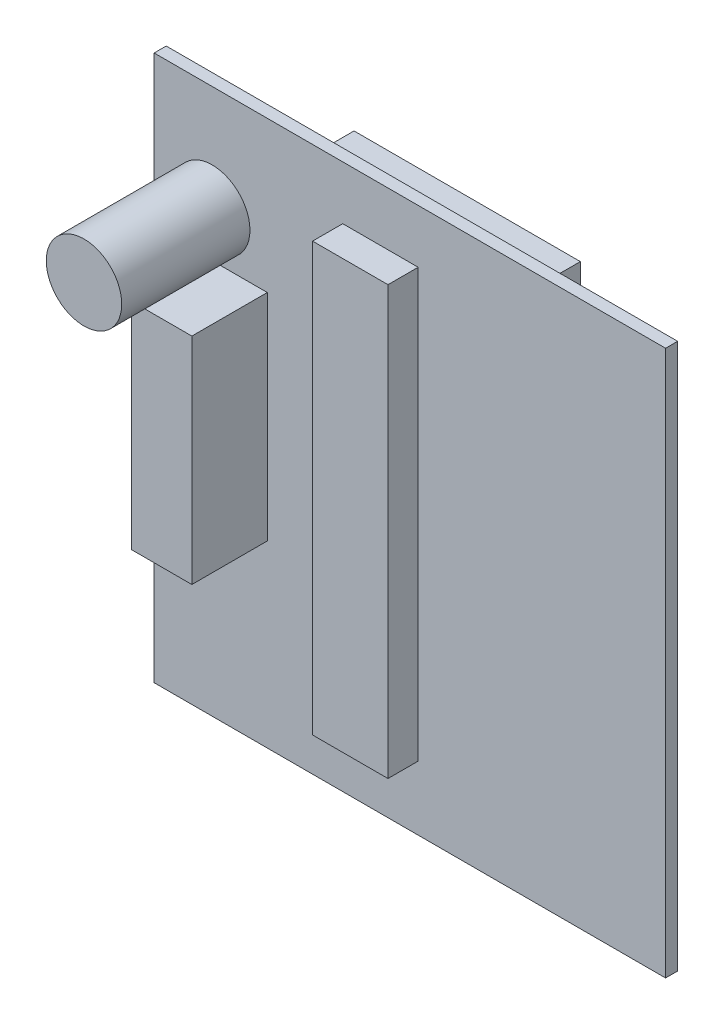
ISO-10303-21;
HEADER;
FILE_DESCRIPTION(('STEP AP214'),'2;1');
FILE_NAME('part.step','',(''),(''),'','','');
FILE_SCHEMA(('AUTOMOTIVE_DESIGN { 1 0 10303 214 1 1 1 1 }'));
ENDSEC;
DATA;
#1=APPLICATION_CONTEXT('core data for automotive mechanical design processes');
#2=APPLICATION_PROTOCOL_DEFINITION('international standard','automotive_design',2000,#1);
#3=PRODUCT_CONTEXT('',#1,'mechanical');
#4=PRODUCT('Part','Part','',(#3));
#5=PRODUCT_RELATED_PRODUCT_CATEGORY('part','',(#4));
#6=PRODUCT_DEFINITION_FORMATION('','',#4);
#7=PRODUCT_DEFINITION_CONTEXT('part definition',#1,'design');
#8=PRODUCT_DEFINITION('design','',#6,#7);
#9=PRODUCT_DEFINITION_SHAPE('','',#8);
#10=(LENGTH_UNIT() NAMED_UNIT(*) SI_UNIT(.MILLI.,.METRE.));
#11=(NAMED_UNIT(*) PLANE_ANGLE_UNIT() SI_UNIT($,.RADIAN.));
#12=(NAMED_UNIT(*) SI_UNIT($,.STERADIAN.) SOLID_ANGLE_UNIT());
#13=UNCERTAINTY_MEASURE_WITH_UNIT(LENGTH_MEASURE(1.E-05),#10,'distance_accuracy_value','');
#14=(GEOMETRIC_REPRESENTATION_CONTEXT(3) GLOBAL_UNCERTAINTY_ASSIGNED_CONTEXT((#13)) GLOBAL_UNIT_ASSIGNED_CONTEXT((#10,
#11,#12)) REPRESENTATION_CONTEXT('',''));
#15=CARTESIAN_POINT('',(0.,0.,0.));
#16=DIRECTION('',(0.,0.,1.));
#17=DIRECTION('',(1.,0.,0.));
#18=AXIS2_PLACEMENT_3D('',#15,#16,#17);
#19=CARTESIAN_POINT('',(0.,0.,0.));
#20=DIRECTION('',(0.,0.,1.));
#21=DIRECTION('',(1.,0.,0.));
#22=AXIS2_PLACEMENT_3D('',#19,#20,#21);
#23=PLANE('',#22);
#24=DIRECTION('',(0.,-1.,0.));
#25=VECTOR('',#24,1.);
#26=CARTESIAN_POINT('',(-38.178640776699,53.9347572815534,0.));
#27=LINE('',#26,#25);
#28=CARTESIAN_POINT('',(-38.178640776699,53.9347572815534,0.));
#29=VERTEX_POINT('',#28);
#30=CARTESIAN_POINT('',(-38.178640776699,-18.3652427184466,0.));
#31=VERTEX_POINT('',#30);
#32=EDGE_CURVE('E235',#29,#31,#27,.T.);
#33=ORIENTED_EDGE('',*,*,#32,.F.);
#34=DIRECTION('',(-1.,0.,0.));
#35=VECTOR('',#34,1.);
#36=CARTESIAN_POINT('',(-38.178640776699,53.9347572815534,0.));
#37=LINE('',#36,#35);
#38=CARTESIAN_POINT('',(29.621359223301,53.9347572815534,0.));
#39=VERTEX_POINT('',#38);
#40=EDGE_CURVE('E240',#39,#29,#37,.T.);
#41=ORIENTED_EDGE('',*,*,#40,.F.);
#42=DIRECTION('',(0.,1.,0.));
#43=VECTOR('',#42,1.);
#44=CARTESIAN_POINT('',(29.621359223301,53.9347572815534,0.));
#45=LINE('',#44,#43);
#46=CARTESIAN_POINT('',(29.621359223301,-18.3652427184466,0.));
#47=VERTEX_POINT('',#46);
#48=EDGE_CURVE('E251',#47,#39,#45,.T.);
#49=ORIENTED_EDGE('',*,*,#48,.F.);
#50=DIRECTION('',(1.,0.,0.));
#51=VECTOR('',#50,1.);
#52=CARTESIAN_POINT('',(-38.178640776699,-18.3652427184466,0.));
#53=LINE('',#52,#51);
#54=EDGE_CURVE('E249',#31,#47,#53,.T.);
#55=ORIENTED_EDGE('',*,*,#54,.F.);
#56=EDGE_LOOP('',(#33,#41,#49,#55));
#57=FACE_BOUND('',#56,.T.);
#58=DIRECTION('',(0.,1.,0.));
#59=VECTOR('',#58,1.);
#60=CARTESIAN_POINT('',(-23.278640776699,-12.6652427184466,0.));
#61=LINE('',#60,#59);
#62=CARTESIAN_POINT('',(-23.278640776699,-12.6652427184466,0.));
#63=VERTEX_POINT('',#62);
#64=CARTESIAN_POINT('',(-23.278640776699,46.6347572815534,0.));
#65=VERTEX_POINT('',#64);
#66=EDGE_CURVE('E48',#63,#65,#61,.T.);
#67=ORIENTED_EDGE('',*,*,#66,.F.);
#68=DIRECTION('',(-1.,0.,0.));
#69=VECTOR('',#68,1.);
#70=CARTESIAN_POINT('',(-23.278640776699,-12.6652427184466,0.));
#71=LINE('',#70,#69);
#72=CARTESIAN_POINT('',(6.72135922330096,-12.6652427184466,0.));
#73=VERTEX_POINT('',#72);
#74=EDGE_CURVE('E52',#73,#63,#71,.T.);
#75=ORIENTED_EDGE('',*,*,#74,.F.);
#76=DIRECTION('',(0.,-1.,0.));
#77=VECTOR('',#76,1.);
#78=CARTESIAN_POINT('',(6.72135922330096,-12.6652427184466,0.));
#79=LINE('',#78,#77);
#80=CARTESIAN_POINT('',(6.72135922330096,46.6347572815534,0.));
#81=VERTEX_POINT('',#80);
#82=EDGE_CURVE('E494',#81,#73,#79,.T.);
#83=ORIENTED_EDGE('',*,*,#82,.F.);
#84=DIRECTION('',(1.,0.,0.));
#85=VECTOR('',#84,1.);
#86=CARTESIAN_POINT('',(-23.278640776699,46.6347572815534,0.));
#87=LINE('',#86,#85);
#88=EDGE_CURVE('E500',#65,#81,#87,.T.);
#89=ORIENTED_EDGE('',*,*,#88,.F.);
#90=EDGE_LOOP('',(#67,#75,#83,#89));
#91=FACE_BOUND('',#90,.T.);
#92=ADVANCED_FACE('F33',(#57,#91),#23,.F.);
#93=CARTESIAN_POINT('',(0.,0.,1.6));
#94=DIRECTION('',(0.,0.,1.));
#95=DIRECTION('',(1.,0.,0.));
#96=AXIS2_PLACEMENT_3D('',#93,#94,#95);
#97=PLANE('',#96);
#98=CARTESIAN_POINT('',(-30.478640776699,39.9347572815534,1.6));
#99=DIRECTION('',(0.,0.,1.));
#100=DIRECTION('',(1.,0.,0.));
#101=AXIS2_PLACEMENT_3D('',#98,#99,#100);
#102=CIRCLE('',#101,5.);
#103=CARTESIAN_POINT('',(-25.478640776699,39.9347572815534,1.6));
#104=VERTEX_POINT('',#103);
#105=EDGE_CURVE('E166',#104,#104,#102,.T.);
#106=ORIENTED_EDGE('',*,*,#105,.F.);
#107=EDGE_LOOP('',(#106));
#108=FACE_BOUND('',#107,.T.);
#109=DIRECTION('',(0.,-1.,0.));
#110=VECTOR('',#109,1.);
#111=CARTESIAN_POINT('',(-38.178640776699,53.9347572815534,1.6));
#112=LINE('',#111,#110);
#113=CARTESIAN_POINT('',(-38.178640776699,53.9347572815534,1.6));
#114=VERTEX_POINT('',#113);
#115=CARTESIAN_POINT('',(-38.178640776699,-18.3652427184466,1.6));
#116=VERTEX_POINT('',#115);
#117=EDGE_CURVE('E236',#114,#116,#112,.T.);
#118=ORIENTED_EDGE('',*,*,#117,.T.);
#119=DIRECTION('',(1.,0.,0.));
#120=VECTOR('',#119,1.);
#121=CARTESIAN_POINT('',(-38.178640776699,-18.3652427184466,1.6));
#122=LINE('',#121,#120);
#123=CARTESIAN_POINT('',(29.621359223301,-18.3652427184466,1.6));
#124=VERTEX_POINT('',#123);
#125=EDGE_CURVE('E239',#116,#124,#122,.T.);
#126=ORIENTED_EDGE('',*,*,#125,.T.);
#127=DIRECTION('',(0.,1.,0.));
#128=VECTOR('',#127,1.);
#129=CARTESIAN_POINT('',(29.621359223301,53.9347572815534,1.6));
#130=LINE('',#129,#128);
#131=CARTESIAN_POINT('',(29.621359223301,53.9347572815534,1.6));
#132=VERTEX_POINT('',#131);
#133=EDGE_CURVE('E242',#124,#132,#130,.T.);
#134=ORIENTED_EDGE('',*,*,#133,.T.);
#135=DIRECTION('',(-1.,0.,0.));
#136=VECTOR('',#135,1.);
#137=CARTESIAN_POINT('',(-38.178640776699,53.9347572815534,1.6));
#138=LINE('',#137,#136);
#139=EDGE_CURVE('E244',#132,#114,#138,.T.);
#140=ORIENTED_EDGE('',*,*,#139,.T.);
#141=EDGE_LOOP('',(#118,#126,#134,#140));
#142=FACE_BOUND('',#141,.T.);
#143=DIRECTION('',(-1.,0.,0.));
#144=VECTOR('',#143,1.);
#145=CARTESIAN_POINT('',(-3.17864077669904,46.8347572815534,1.6));
#146=LINE('',#145,#144);
#147=CARTESIAN_POINT('',(-3.17864077669904,46.8347572815534,1.6));
#148=VERTEX_POINT('',#147);
#149=CARTESIAN_POINT('',(-13.178640776699,46.8347572815534,1.6));
#150=VERTEX_POINT('',#149);
#151=EDGE_CURVE('E220',#148,#150,#146,.T.);
#152=ORIENTED_EDGE('',*,*,#151,.F.);
#153=DIRECTION('',(0.,1.,0.));
#154=VECTOR('',#153,1.);
#155=CARTESIAN_POINT('',(-3.17864077669904,46.8347572815534,1.6));
#156=LINE('',#155,#154);
#157=CARTESIAN_POINT('',(-3.17864077669903,-9.86514060359954,1.6));
#158=VERTEX_POINT('',#157);
#159=EDGE_CURVE('E206',#158,#148,#156,.T.);
#160=ORIENTED_EDGE('',*,*,#159,.F.);
#161=DIRECTION('',(1.,0.,0.));
#162=VECTOR('',#161,1.);
#163=CARTESIAN_POINT('',(-3.17864077669903,-9.86514060359954,1.6));
#164=LINE('',#163,#162);
#165=CARTESIAN_POINT('',(-13.178640776699,-9.86514060359954,1.6));
#166=VERTEX_POINT('',#165);
#167=EDGE_CURVE('E211',#166,#158,#164,.T.);
#168=ORIENTED_EDGE('',*,*,#167,.F.);
#169=DIRECTION('',(0.,-1.,0.));
#170=VECTOR('',#169,1.);
#171=CARTESIAN_POINT('',(-13.178640776699,46.8347572815534,1.6));
#172=LINE('',#171,#170);
#173=EDGE_CURVE('E222',#150,#166,#172,.T.);
#174=ORIENTED_EDGE('',*,*,#173,.F.);
#175=EDGE_LOOP('',(#152,#160,#168,#174));
#176=FACE_BOUND('',#175,.T.);
#177=DIRECTION('',(1.,0.,0.));
#178=VECTOR('',#177,1.);
#179=CARTESIAN_POINT('',(-31.178640776699,5.40944344496812,1.6));
#180=LINE('',#179,#178);
#181=CARTESIAN_POINT('',(-31.178640776699,5.40944344496812,1.6));
#182=VERTEX_POINT('',#181);
#183=CARTESIAN_POINT('',(-23.178640776699,5.40944344496812,1.6));
#184=VERTEX_POINT('',#183);
#185=EDGE_CURVE('E191',#182,#184,#180,.T.);
#186=ORIENTED_EDGE('',*,*,#185,.F.);
#187=DIRECTION('',(0.,-1.,0.));
#188=VECTOR('',#187,1.);
#189=CARTESIAN_POINT('',(-31.178640776699,33.9347572815534,1.6));
#190=LINE('',#189,#188);
#191=CARTESIAN_POINT('',(-31.178640776699,33.9347572815534,1.6));
#192=VERTEX_POINT('',#191);
#193=EDGE_CURVE('E176',#192,#182,#190,.T.);
#194=ORIENTED_EDGE('',*,*,#193,.F.);
#195=DIRECTION('',(-1.,0.,0.));
#196=VECTOR('',#195,1.);
#197=CARTESIAN_POINT('',(-31.178640776699,33.9347572815534,1.6));
#198=LINE('',#197,#196);
#199=CARTESIAN_POINT('',(-23.178640776699,33.9347572815534,1.6));
#200=VERTEX_POINT('',#199);
#201=EDGE_CURVE('E182',#200,#192,#198,.T.);
#202=ORIENTED_EDGE('',*,*,#201,.F.);
#203=DIRECTION('',(0.,1.,0.));
#204=VECTOR('',#203,1.);
#205=CARTESIAN_POINT('',(-23.178640776699,33.9347572815534,1.6));
#206=LINE('',#205,#204);
#207=EDGE_CURVE('E193',#184,#200,#206,.T.);
#208=ORIENTED_EDGE('',*,*,#207,.F.);
#209=EDGE_LOOP('',(#186,#194,#202,#208));
#210=FACE_BOUND('',#209,.T.);
#211=ADVANCED_FACE('F277',(#108,#142,#176,#210),#97,.T.);
#212=CARTESIAN_POINT('',(-38.178640776699,53.9347572815534,1.6));
#213=DIRECTION('',(1.,0.,0.));
#214=DIRECTION('',(0.,1.,0.));
#215=AXIS2_PLACEMENT_3D('',#212,#213,#214);
#216=PLANE('',#215);
#217=ORIENTED_EDGE('',*,*,#32,.T.);
#218=DIRECTION('',(0.,0.,-1.));
#219=VECTOR('',#218,1.);
#220=CARTESIAN_POINT('',(-38.178640776699,-18.3652427184466,1.6));
#221=LINE('',#220,#219);
#222=EDGE_CURVE('E11',#116,#31,#221,.T.);
#223=ORIENTED_EDGE('',*,*,#222,.F.);
#224=ORIENTED_EDGE('',*,*,#117,.F.);
#225=DIRECTION('',(0.,0.,-1.));
#226=VECTOR('',#225,1.);
#227=CARTESIAN_POINT('',(-38.178640776699,53.9347572815534,1.6));
#228=LINE('',#227,#226);
#229=EDGE_CURVE('E246',#114,#29,#228,.T.);
#230=ORIENTED_EDGE('',*,*,#229,.T.);
#231=EDGE_LOOP('',(#217,#223,#224,#230));
#232=FACE_BOUND('',#231,.T.);
#233=ADVANCED_FACE('F35',(#232),#216,.F.);
#234=CARTESIAN_POINT('',(-38.178640776699,-18.3652427184466,1.6));
#235=DIRECTION('',(0.,1.,0.));
#236=DIRECTION('',(0.,0.,1.));
#237=AXIS2_PLACEMENT_3D('',#234,#235,#236);
#238=PLANE('',#237);
#239=ORIENTED_EDGE('',*,*,#54,.T.);
#240=DIRECTION('',(0.,0.,-1.));
#241=VECTOR('',#240,1.);
#242=CARTESIAN_POINT('',(29.621359223301,-18.3652427184466,1.6));
#243=LINE('',#242,#241);
#244=EDGE_CURVE('E41',#124,#47,#243,.T.);
#245=ORIENTED_EDGE('',*,*,#244,.F.);
#246=ORIENTED_EDGE('',*,*,#125,.F.);
#247=ORIENTED_EDGE('',*,*,#222,.T.);
#248=EDGE_LOOP('',(#239,#245,#246,#247));
#249=FACE_BOUND('',#248,.T.);
#250=ADVANCED_FACE('F279',(#249),#238,.F.);
#251=CARTESIAN_POINT('',(29.621359223301,53.9347572815534,1.6));
#252=DIRECTION('',(-1.,0.,0.));
#253=DIRECTION('',(0.,-1.,0.));
#254=AXIS2_PLACEMENT_3D('',#251,#252,#253);
#255=PLANE('',#254);
#256=ORIENTED_EDGE('',*,*,#48,.T.);
#257=DIRECTION('',(0.,0.,-1.));
#258=VECTOR('',#257,1.);
#259=CARTESIAN_POINT('',(29.621359223301,53.9347572815534,1.6));
#260=LINE('',#259,#258);
#261=EDGE_CURVE('E256',#132,#39,#260,.T.);
#262=ORIENTED_EDGE('',*,*,#261,.F.);
#263=ORIENTED_EDGE('',*,*,#133,.F.);
#264=ORIENTED_EDGE('',*,*,#244,.T.);
#265=EDGE_LOOP('',(#256,#262,#263,#264));
#266=FACE_BOUND('',#265,.T.);
#267=ADVANCED_FACE('F263',(#266),#255,.F.);
#268=CARTESIAN_POINT('',(-38.178640776699,53.9347572815534,1.6));
#269=DIRECTION('',(0.,-1.,0.));
#270=DIRECTION('',(0.,0.,-1.));
#271=AXIS2_PLACEMENT_3D('',#268,#269,#270);
#272=PLANE('',#271);
#273=ORIENTED_EDGE('',*,*,#40,.T.);
#274=ORIENTED_EDGE('',*,*,#229,.F.);
#275=ORIENTED_EDGE('',*,*,#139,.F.);
#276=ORIENTED_EDGE('',*,*,#261,.T.);
#277=EDGE_LOOP('',(#273,#274,#275,#276));
#278=FACE_BOUND('',#277,.T.);
#279=ADVANCED_FACE('F271',(#278),#272,.F.);
#280=CARTESIAN_POINT('',(-3.17864077669904,46.8347572815534,5.6));
#281=DIRECTION('',(-1.,0.,0.));
#282=DIRECTION('',(0.,-1.,0.));
#283=AXIS2_PLACEMENT_3D('',#280,#281,#282);
#284=PLANE('',#283);
#285=ORIENTED_EDGE('',*,*,#159,.T.);
#286=DIRECTION('',(0.,0.,-1.));
#287=VECTOR('',#286,1.);
#288=CARTESIAN_POINT('',(-3.17864077669904,46.8347572815534,5.6));
#289=LINE('',#288,#287);
#290=CARTESIAN_POINT('',(-3.17864077669904,46.8347572815534,5.6));
#291=VERTEX_POINT('',#290);
#292=EDGE_CURVE('E233',#291,#148,#289,.T.);
#293=ORIENTED_EDGE('',*,*,#292,.F.);
#294=DIRECTION('',(0.,1.,0.));
#295=VECTOR('',#294,1.);
#296=CARTESIAN_POINT('',(-3.17864077669904,46.8347572815534,5.6));
#297=LINE('',#296,#295);
#298=CARTESIAN_POINT('',(-3.17864077669903,-9.86514060359954,5.6));
#299=VERTEX_POINT('',#298);
#300=EDGE_CURVE('E207',#299,#291,#297,.T.);
#301=ORIENTED_EDGE('',*,*,#300,.F.);
#302=DIRECTION('',(0.,0.,-1.));
#303=VECTOR('',#302,1.);
#304=CARTESIAN_POINT('',(-3.17864077669903,-9.86514060359954,5.6));
#305=LINE('',#304,#303);
#306=EDGE_CURVE('E217',#299,#158,#305,.T.);
#307=ORIENTED_EDGE('',*,*,#306,.T.);
#308=EDGE_LOOP('',(#285,#293,#301,#307));
#309=FACE_BOUND('',#308,.T.);
#310=ADVANCED_FACE('F296',(#309),#284,.F.);
#311=CARTESIAN_POINT('',(-3.17864077669904,46.8347572815534,5.6));
#312=DIRECTION('',(0.,-1.,0.));
#313=DIRECTION('',(0.,0.,-1.));
#314=AXIS2_PLACEMENT_3D('',#311,#312,#313);
#315=PLANE('',#314);
#316=ORIENTED_EDGE('',*,*,#151,.T.);
#317=DIRECTION('',(0.,0.,-1.));
#318=VECTOR('',#317,1.);
#319=CARTESIAN_POINT('',(-13.178640776699,46.8347572815534,5.6));
#320=LINE('',#319,#318);
#321=CARTESIAN_POINT('',(-13.178640776699,46.8347572815534,5.6));
#322=VERTEX_POINT('',#321);
#323=EDGE_CURVE('E230',#322,#150,#320,.T.);
#324=ORIENTED_EDGE('',*,*,#323,.F.);
#325=DIRECTION('',(-1.,0.,0.));
#326=VECTOR('',#325,1.);
#327=CARTESIAN_POINT('',(-3.17864077669904,46.8347572815534,5.6));
#328=LINE('',#327,#326);
#329=EDGE_CURVE('E210',#291,#322,#328,.T.);
#330=ORIENTED_EDGE('',*,*,#329,.F.);
#331=ORIENTED_EDGE('',*,*,#292,.T.);
#332=EDGE_LOOP('',(#316,#324,#330,#331));
#333=FACE_BOUND('',#332,.T.);
#334=ADVANCED_FACE('F300',(#333),#315,.F.);
#335=CARTESIAN_POINT('',(-13.178640776699,46.8347572815534,5.6));
#336=DIRECTION('',(1.,0.,0.));
#337=DIRECTION('',(0.,1.,0.));
#338=AXIS2_PLACEMENT_3D('',#335,#336,#337);
#339=PLANE('',#338);
#340=ORIENTED_EDGE('',*,*,#173,.T.);
#341=DIRECTION('',(0.,0.,-1.));
#342=VECTOR('',#341,1.);
#343=CARTESIAN_POINT('',(-13.178640776699,-9.86514060359954,5.6));
#344=LINE('',#343,#342);
#345=CARTESIAN_POINT('',(-13.178640776699,-9.86514060359954,5.6));
#346=VERTEX_POINT('',#345);
#347=EDGE_CURVE('E228',#346,#166,#344,.T.);
#348=ORIENTED_EDGE('',*,*,#347,.F.);
#349=DIRECTION('',(0.,-1.,0.));
#350=VECTOR('',#349,1.);
#351=CARTESIAN_POINT('',(-13.178640776699,46.8347572815534,5.6));
#352=LINE('',#351,#350);
#353=EDGE_CURVE('E213',#322,#346,#352,.T.);
#354=ORIENTED_EDGE('',*,*,#353,.F.);
#355=ORIENTED_EDGE('',*,*,#323,.T.);
#356=EDGE_LOOP('',(#340,#348,#354,#355));
#357=FACE_BOUND('',#356,.T.);
#358=ADVANCED_FACE('F305',(#357),#339,.F.);
#359=CARTESIAN_POINT('',(-3.17864077669903,-9.86514060359954,5.6));
#360=DIRECTION('',(0.,1.,0.));
#361=DIRECTION('',(-1.,0.,0.));
#362=AXIS2_PLACEMENT_3D('',#359,#360,#361);
#363=PLANE('',#362);
#364=ORIENTED_EDGE('',*,*,#167,.T.);
#365=ORIENTED_EDGE('',*,*,#306,.F.);
#366=DIRECTION('',(1.,0.,0.));
#367=VECTOR('',#366,1.);
#368=CARTESIAN_POINT('',(-3.17864077669903,-9.86514060359954,5.6));
#369=LINE('',#368,#367);
#370=EDGE_CURVE('E215',#346,#299,#369,.T.);
#371=ORIENTED_EDGE('',*,*,#370,.F.);
#372=ORIENTED_EDGE('',*,*,#347,.T.);
#373=EDGE_LOOP('',(#364,#365,#371,#372));
#374=FACE_BOUND('',#373,.T.);
#375=ADVANCED_FACE('F311',(#374),#363,.F.);
#376=CARTESIAN_POINT('',(0.,0.,5.6));
#377=DIRECTION('',(0.,0.,-1.));
#378=DIRECTION('',(-1.,0.,0.));
#379=AXIS2_PLACEMENT_3D('',#376,#377,#378);
#380=PLANE('',#379);
#381=ORIENTED_EDGE('',*,*,#300,.T.);
#382=ORIENTED_EDGE('',*,*,#329,.T.);
#383=ORIENTED_EDGE('',*,*,#353,.T.);
#384=ORIENTED_EDGE('',*,*,#370,.T.);
#385=EDGE_LOOP('',(#381,#382,#383,#384));
#386=FACE_BOUND('',#385,.T.);
#387=ADVANCED_FACE('F315',(#386),#380,.F.);
#388=CARTESIAN_POINT('',(-31.178640776699,33.9347572815534,11.6));
#389=DIRECTION('',(1.,0.,0.));
#390=DIRECTION('',(0.,1.,0.));
#391=AXIS2_PLACEMENT_3D('',#388,#389,#390);
#392=PLANE('',#391);
#393=ORIENTED_EDGE('',*,*,#193,.T.);
#394=DIRECTION('',(0.,0.,-1.));
#395=VECTOR('',#394,1.);
#396=CARTESIAN_POINT('',(-31.178640776699,5.40944344496812,11.6));
#397=LINE('',#396,#395);
#398=CARTESIAN_POINT('',(-31.178640776699,5.40944344496812,11.6));
#399=VERTEX_POINT('',#398);
#400=EDGE_CURVE('E204',#399,#182,#397,.T.);
#401=ORIENTED_EDGE('',*,*,#400,.F.);
#402=DIRECTION('',(0.,-1.,0.));
#403=VECTOR('',#402,1.);
#404=CARTESIAN_POINT('',(-31.178640776699,33.9347572815534,11.6));
#405=LINE('',#404,#403);
#406=CARTESIAN_POINT('',(-31.178640776699,33.9347572815534,11.6));
#407=VERTEX_POINT('',#406);
#408=EDGE_CURVE('E178',#407,#399,#405,.T.);
#409=ORIENTED_EDGE('',*,*,#408,.F.);
#410=DIRECTION('',(0.,0.,-1.));
#411=VECTOR('',#410,1.);
#412=CARTESIAN_POINT('',(-31.178640776699,33.9347572815534,11.6));
#413=LINE('',#412,#411);
#414=EDGE_CURVE('E188',#407,#192,#413,.T.);
#415=ORIENTED_EDGE('',*,*,#414,.T.);
#416=EDGE_LOOP('',(#393,#401,#409,#415));
#417=FACE_BOUND('',#416,.T.);
#418=ADVANCED_FACE('F319',(#417),#392,.F.);
#419=CARTESIAN_POINT('',(-31.178640776699,5.40944344496812,11.6));
#420=DIRECTION('',(0.,1.,0.));
#421=DIRECTION('',(0.,0.,1.));
#422=AXIS2_PLACEMENT_3D('',#419,#420,#421);
#423=PLANE('',#422);
#424=ORIENTED_EDGE('',*,*,#185,.T.);
#425=DIRECTION('',(0.,0.,-1.));
#426=VECTOR('',#425,1.);
#427=CARTESIAN_POINT('',(-23.178640776699,5.40944344496812,11.6));
#428=LINE('',#427,#426);
#429=CARTESIAN_POINT('',(-23.178640776699,5.40944344496812,11.6));
#430=VERTEX_POINT('',#429);
#431=EDGE_CURVE('E201',#430,#184,#428,.T.);
#432=ORIENTED_EDGE('',*,*,#431,.F.);
#433=DIRECTION('',(1.,0.,0.));
#434=VECTOR('',#433,1.);
#435=CARTESIAN_POINT('',(-31.178640776699,5.40944344496812,11.6));
#436=LINE('',#435,#434);
#437=EDGE_CURVE('E181',#399,#430,#436,.T.);
#438=ORIENTED_EDGE('',*,*,#437,.F.);
#439=ORIENTED_EDGE('',*,*,#400,.T.);
#440=EDGE_LOOP('',(#424,#432,#438,#439));
#441=FACE_BOUND('',#440,.T.);
#442=ADVANCED_FACE('F323',(#441),#423,.F.);
#443=CARTESIAN_POINT('',(-23.178640776699,33.9347572815534,11.6));
#444=DIRECTION('',(-1.,0.,0.));
#445=DIRECTION('',(0.,-1.,0.));
#446=AXIS2_PLACEMENT_3D('',#443,#444,#445);
#447=PLANE('',#446);
#448=ORIENTED_EDGE('',*,*,#207,.T.);
#449=DIRECTION('',(0.,0.,-1.));
#450=VECTOR('',#449,1.);
#451=CARTESIAN_POINT('',(-23.178640776699,33.9347572815534,11.6));
#452=LINE('',#451,#450);
#453=CARTESIAN_POINT('',(-23.178640776699,33.9347572815534,11.6));
#454=VERTEX_POINT('',#453);
#455=EDGE_CURVE('E199',#454,#200,#452,.T.);
#456=ORIENTED_EDGE('',*,*,#455,.F.);
#457=DIRECTION('',(0.,1.,0.));
#458=VECTOR('',#457,1.);
#459=CARTESIAN_POINT('',(-23.178640776699,33.9347572815534,11.6));
#460=LINE('',#459,#458);
#461=EDGE_CURVE('E184',#430,#454,#460,.T.);
#462=ORIENTED_EDGE('',*,*,#461,.F.);
#463=ORIENTED_EDGE('',*,*,#431,.T.);
#464=EDGE_LOOP('',(#448,#456,#462,#463));
#465=FACE_BOUND('',#464,.T.);
#466=ADVANCED_FACE('F327',(#465),#447,.F.);
#467=CARTESIAN_POINT('',(-31.178640776699,33.9347572815534,11.6));
#468=DIRECTION('',(0.,-1.,0.));
#469=DIRECTION('',(0.,0.,-1.));
#470=AXIS2_PLACEMENT_3D('',#467,#468,#469);
#471=PLANE('',#470);
#472=ORIENTED_EDGE('',*,*,#201,.T.);
#473=ORIENTED_EDGE('',*,*,#414,.F.);
#474=DIRECTION('',(-1.,0.,0.));
#475=VECTOR('',#474,1.);
#476=CARTESIAN_POINT('',(-31.178640776699,33.9347572815534,11.6));
#477=LINE('',#476,#475);
#478=EDGE_CURVE('E186',#454,#407,#477,.T.);
#479=ORIENTED_EDGE('',*,*,#478,.F.);
#480=ORIENTED_EDGE('',*,*,#455,.T.);
#481=EDGE_LOOP('',(#472,#473,#479,#480));
#482=FACE_BOUND('',#481,.T.);
#483=ADVANCED_FACE('F331',(#482),#471,.F.);
#484=CARTESIAN_POINT('',(0.,0.,11.6));
#485=DIRECTION('',(0.,0.,1.));
#486=DIRECTION('',(1.,0.,0.));
#487=AXIS2_PLACEMENT_3D('',#484,#485,#486);
#488=PLANE('',#487);
#489=ORIENTED_EDGE('',*,*,#408,.T.);
#490=ORIENTED_EDGE('',*,*,#437,.T.);
#491=ORIENTED_EDGE('',*,*,#461,.T.);
#492=ORIENTED_EDGE('',*,*,#478,.T.);
#493=EDGE_LOOP('',(#489,#490,#491,#492));
#494=FACE_BOUND('',#493,.T.);
#495=ADVANCED_FACE('F335',(#494),#488,.T.);
#496=CARTESIAN_POINT('',(-30.478640776699,39.9347572815534,18.6));
#497=DIRECTION('',(0.,0.,-1.));
#498=DIRECTION('',(-1.,0.,0.));
#499=AXIS2_PLACEMENT_3D('',#496,#497,#498);
#500=CYLINDRICAL_SURFACE('',#499,5.);
#501=CARTESIAN_POINT('',(-30.478640776699,39.9347572815534,18.6));
#502=DIRECTION('',(0.,0.,1.));
#503=DIRECTION('',(1.,0.,0.));
#504=AXIS2_PLACEMENT_3D('',#501,#502,#503);
#505=CIRCLE('',#504,5.);
#506=CARTESIAN_POINT('',(-25.478640776699,39.9347572815534,18.6));
#507=VERTEX_POINT('',#506);
#508=EDGE_CURVE('E169',#507,#507,#505,.T.);
#509=ORIENTED_EDGE('',*,*,#508,.F.);
#510=EDGE_LOOP('',(#509));
#511=FACE_BOUND('',#510,.T.);
#512=ORIENTED_EDGE('',*,*,#105,.T.);
#513=EDGE_LOOP('',(#512));
#514=FACE_BOUND('',#513,.T.);
#515=ADVANCED_FACE('F339',(#511,#514),#500,.T.);
#516=CARTESIAN_POINT('',(-30.478640776699,39.9347572815534,18.6));
#517=DIRECTION('',(0.,0.,1.));
#518=DIRECTION('',(1.,0.,0.));
#519=AXIS2_PLACEMENT_3D('',#516,#517,#518);
#520=PLANE('',#519);
#521=ORIENTED_EDGE('',*,*,#508,.T.);
#522=EDGE_LOOP('',(#521));
#523=FACE_BOUND('',#522,.T.);
#524=ADVANCED_FACE('F343',(#523),#520,.T.);
#525=CARTESIAN_POINT('',(-23.278640776699,-12.6652427184466,-10.));
#526=DIRECTION('',(1.,0.,0.));
#527=DIRECTION('',(0.,0.,-1.));
#528=AXIS2_PLACEMENT_3D('',#525,#526,#527);
#529=PLANE('',#528);
#530=ORIENTED_EDGE('',*,*,#66,.T.);
#531=DIRECTION('',(0.,0.,1.));
#532=VECTOR('',#531,1.);
#533=CARTESIAN_POINT('',(-23.278640776699,46.6347572815534,-10.));
#534=LINE('',#533,#532);
#535=CARTESIAN_POINT('',(-23.278640776699,46.6347572815534,-10.));
#536=VERTEX_POINT('',#535);
#537=EDGE_CURVE('E149',#536,#65,#534,.T.);
#538=ORIENTED_EDGE('',*,*,#537,.F.);
#539=DIRECTION('',(0.,1.,0.));
#540=VECTOR('',#539,1.);
#541=CARTESIAN_POINT('',(-23.278640776699,-12.6652427184466,-10.));
#542=LINE('',#541,#540);
#543=CARTESIAN_POINT('',(-23.278640776699,-12.6652427184466,-10.));
#544=VERTEX_POINT('',#543);
#545=EDGE_CURVE('E155',#544,#536,#542,.T.);
#546=ORIENTED_EDGE('',*,*,#545,.F.);
#547=DIRECTION('',(0.,0.,1.));
#548=VECTOR('',#547,1.);
#549=CARTESIAN_POINT('',(-23.278640776699,-12.6652427184466,-10.));
#550=LINE('',#549,#548);
#551=EDGE_CURVE('E492',#544,#63,#550,.T.);
#552=ORIENTED_EDGE('',*,*,#551,.T.);
#553=EDGE_LOOP('',(#530,#538,#546,#552));
#554=FACE_BOUND('',#553,.T.);
#555=ADVANCED_FACE('F165',(#554),#529,.F.);
#556=CARTESIAN_POINT('',(-23.278640776699,46.6347572815534,-10.));
#557=DIRECTION('',(0.,-1.,0.));
#558=DIRECTION('',(0.,0.,-1.));
#559=AXIS2_PLACEMENT_3D('',#556,#557,#558);
#560=PLANE('',#559);
#561=ORIENTED_EDGE('',*,*,#88,.T.);
#562=DIRECTION('',(0.,0.,1.));
#563=VECTOR('',#562,1.);
#564=CARTESIAN_POINT('',(6.72135922330096,46.6347572815534,-10.));
#565=LINE('',#564,#563);
#566=CARTESIAN_POINT('',(6.72135922330096,46.6347572815534,-10.));
#567=VERTEX_POINT('',#566);
#568=EDGE_CURVE('E151',#567,#81,#565,.T.);
#569=ORIENTED_EDGE('',*,*,#568,.F.);
#570=DIRECTION('',(1.,0.,0.));
#571=VECTOR('',#570,1.);
#572=CARTESIAN_POINT('',(-23.278640776699,46.6347572815534,-10.));
#573=LINE('',#572,#571);
#574=EDGE_CURVE('E144',#536,#567,#573,.T.);
#575=ORIENTED_EDGE('',*,*,#574,.F.);
#576=ORIENTED_EDGE('',*,*,#537,.T.);
#577=EDGE_LOOP('',(#561,#569,#575,#576));
#578=FACE_BOUND('',#577,.T.);
#579=ADVANCED_FACE('F147',(#578),#560,.F.);
#580=CARTESIAN_POINT('',(6.72135922330096,-12.6652427184466,-10.));
#581=DIRECTION('',(-1.,0.,0.));
#582=DIRECTION('',(0.,0.,1.));
#583=AXIS2_PLACEMENT_3D('',#580,#581,#582);
#584=PLANE('',#583);
#585=ORIENTED_EDGE('',*,*,#82,.T.);
#586=DIRECTION('',(0.,0.,1.));
#587=VECTOR('',#586,1.);
#588=CARTESIAN_POINT('',(6.72135922330096,-12.6652427184466,-10.));
#589=LINE('',#588,#587);
#590=CARTESIAN_POINT('',(6.72135922330096,-12.6652427184466,-10.));
#591=VERTEX_POINT('',#590);
#592=EDGE_CURVE('E171',#591,#73,#589,.T.);
#593=ORIENTED_EDGE('',*,*,#592,.F.);
#594=DIRECTION('',(0.,-1.,0.));
#595=VECTOR('',#594,1.);
#596=CARTESIAN_POINT('',(6.72135922330096,-12.6652427184466,-10.));
#597=LINE('',#596,#595);
#598=EDGE_CURVE('E154',#567,#591,#597,.T.);
#599=ORIENTED_EDGE('',*,*,#598,.F.);
#600=ORIENTED_EDGE('',*,*,#568,.T.);
#601=EDGE_LOOP('',(#585,#593,#599,#600));
#602=FACE_BOUND('',#601,.T.);
#603=ADVANCED_FACE('F352',(#602),#584,.F.);
#604=CARTESIAN_POINT('',(-23.278640776699,-12.6652427184466,-10.));
#605=DIRECTION('',(0.,1.,0.));
#606=DIRECTION('',(-1.,0.,0.));
#607=AXIS2_PLACEMENT_3D('',#604,#605,#606);
#608=PLANE('',#607);
#609=ORIENTED_EDGE('',*,*,#74,.T.);
#610=ORIENTED_EDGE('',*,*,#551,.F.);
#611=DIRECTION('',(-1.,0.,0.));
#612=VECTOR('',#611,1.);
#613=CARTESIAN_POINT('',(-23.278640776699,-12.6652427184466,-10.));
#614=LINE('',#613,#612);
#615=EDGE_CURVE('E160',#591,#544,#614,.T.);
#616=ORIENTED_EDGE('',*,*,#615,.F.);
#617=ORIENTED_EDGE('',*,*,#592,.T.);
#618=EDGE_LOOP('',(#609,#610,#616,#617));
#619=FACE_BOUND('',#618,.T.);
#620=ADVANCED_FACE('F355',(#619),#608,.F.);
#621=CARTESIAN_POINT('',(0.,0.,-10.));
#622=DIRECTION('',(0.,0.,-1.));
#623=DIRECTION('',(-1.,0.,0.));
#624=AXIS2_PLACEMENT_3D('',#621,#622,#623);
#625=PLANE('',#624);
#626=ORIENTED_EDGE('',*,*,#545,.T.);
#627=ORIENTED_EDGE('',*,*,#574,.T.);
#628=ORIENTED_EDGE('',*,*,#598,.T.);
#629=ORIENTED_EDGE('',*,*,#615,.T.);
#630=EDGE_LOOP('',(#626,#627,#628,#629));
#631=FACE_BOUND('',#630,.T.);
#632=ADVANCED_FACE('F158',(#631),#625,.T.);
#633=CLOSED_SHELL('',(#92,#211,#233,#250,#267,#279,#310,#334,#358,#375,#387,#418,#442,#466,#483,
#495,#515,#524,#555,#579,#603,#620,#632));
#634=MANIFOLD_SOLID_BREP('B2',#633);
#635=ADVANCED_BREP_SHAPE_REPRESENTATION('',(#18,#634),#14);
#636=SHAPE_DEFINITION_REPRESENTATION(#9,#635);
ENDSEC;
END-ISO-10303-21;
